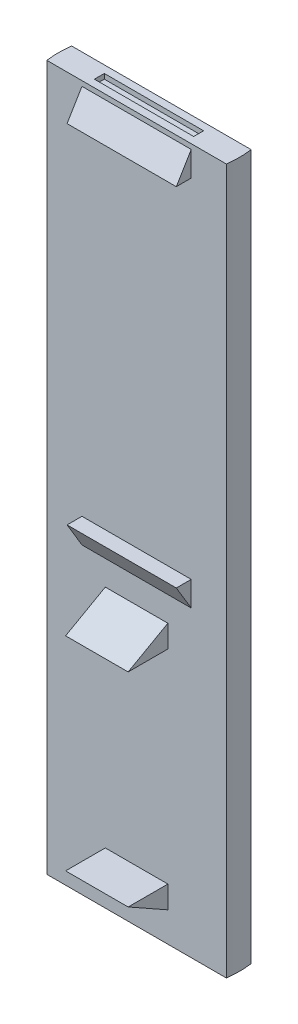
ISO-10303-21;
HEADER;
FILE_DESCRIPTION(('STEP AP214'),'2;1');
FILE_NAME('part.step','',(''),(''),'','','');
FILE_SCHEMA(('AUTOMOTIVE_DESIGN { 1 0 10303 214 1 1 1 1 }'));
ENDSEC;
DATA;
#1=APPLICATION_CONTEXT('core data for automotive mechanical design processes');
#2=APPLICATION_PROTOCOL_DEFINITION('international standard','automotive_design',2000,#1);
#3=PRODUCT_CONTEXT('',#1,'mechanical');
#4=PRODUCT('Part','Part','',(#3));
#5=PRODUCT_RELATED_PRODUCT_CATEGORY('part','',(#4));
#6=PRODUCT_DEFINITION_FORMATION('','',#4);
#7=PRODUCT_DEFINITION_CONTEXT('part definition',#1,'design');
#8=PRODUCT_DEFINITION('design','',#6,#7);
#9=PRODUCT_DEFINITION_SHAPE('','',#8);
#10=(LENGTH_UNIT() NAMED_UNIT(*) SI_UNIT(.MILLI.,.METRE.));
#11=(NAMED_UNIT(*) PLANE_ANGLE_UNIT() SI_UNIT($,.RADIAN.));
#12=(NAMED_UNIT(*) SI_UNIT($,.STERADIAN.) SOLID_ANGLE_UNIT());
#13=UNCERTAINTY_MEASURE_WITH_UNIT(LENGTH_MEASURE(1.E-05),#10,'distance_accuracy_value','');
#14=(GEOMETRIC_REPRESENTATION_CONTEXT(3) GLOBAL_UNCERTAINTY_ASSIGNED_CONTEXT((#13)) GLOBAL_UNIT_ASSIGNED_CONTEXT((#10,
#11,#12)) REPRESENTATION_CONTEXT('',''));
#15=CARTESIAN_POINT('',(0.,0.,0.));
#16=DIRECTION('',(0.,0.,1.));
#17=DIRECTION('',(1.,0.,0.));
#18=AXIS2_PLACEMENT_3D('',#15,#16,#17);
#19=CARTESIAN_POINT('',(49.53,-180.34,12.7));
#20=DIRECTION('',(0.,1.,0.));
#21=DIRECTION('',(0.,0.,1.));
#22=AXIS2_PLACEMENT_3D('',#19,#20,#21);
#23=PLANE('',#22);
#24=DIRECTION('',(0.,0.,1.));
#25=VECTOR('',#24,1.);
#26=CARTESIAN_POINT('',(-25.4,-180.34,8.89));
#27=LINE('',#26,#25);
#28=CARTESIAN_POINT('',(-25.4,-180.34,3.81));
#29=VERTEX_POINT('',#28);
#30=CARTESIAN_POINT('',(-25.4,-180.34,8.89));
#31=VERTEX_POINT('',#30);
#32=EDGE_CURVE('E242',#29,#31,#27,.T.);
#33=ORIENTED_EDGE('',*,*,#32,.T.);
#34=DIRECTION('',(1.,0.,0.));
#35=VECTOR('',#34,1.);
#36=CARTESIAN_POINT('',(25.4,-180.34,8.88999999999999));
#37=LINE('',#36,#35);
#38=CARTESIAN_POINT('',(25.4,-180.34,8.88999999999999));
#39=VERTEX_POINT('',#38);
#40=EDGE_CURVE('E467',#31,#39,#37,.T.);
#41=ORIENTED_EDGE('',*,*,#40,.T.);
#42=DIRECTION('',(0.,0.,-1.));
#43=VECTOR('',#42,1.);
#44=CARTESIAN_POINT('',(25.4,-180.34,8.88999999999999));
#45=LINE('',#44,#43);
#46=CARTESIAN_POINT('',(25.4,-180.34,3.80999999999999));
#47=VERTEX_POINT('',#46);
#48=EDGE_CURVE('E475',#39,#47,#45,.T.);
#49=ORIENTED_EDGE('',*,*,#48,.T.);
#50=DIRECTION('',(-1.,0.,0.));
#51=VECTOR('',#50,1.);
#52=CARTESIAN_POINT('',(25.4,-180.34,3.80999999999999));
#53=LINE('',#52,#51);
#54=EDGE_CURVE('E469',#47,#29,#53,.T.);
#55=ORIENTED_EDGE('',*,*,#54,.T.);
#56=EDGE_LOOP('',(#33,#41,#49,#55));
#57=FACE_BOUND('',#56,.T.);
#58=CARTESIAN_POINT('',(0.,-180.34,6.35));
#59=DIRECTION('',(0.,1.,0.));
#60=DIRECTION('',(0.,0.,1.));
#61=AXIS2_PLACEMENT_3D('',#58,#59,#60);
#62=CIRCLE('',#61,46.355);
#63=CARTESIAN_POINT('',(45.918008722069,-180.34,12.7));
#64=VERTEX_POINT('',#63);
#65=CARTESIAN_POINT('',(45.918008722069,-180.34,0.));
#66=VERTEX_POINT('',#65);
#67=EDGE_CURVE('E236',#64,#66,#62,.T.);
#68=ORIENTED_EDGE('',*,*,#67,.F.);
#69=DIRECTION('',(1.,0.,0.));
#70=VECTOR('',#69,1.);
#71=CARTESIAN_POINT('',(49.53,-180.34,12.7));
#72=LINE('',#71,#70);
#73=CARTESIAN_POINT('',(-45.9180087220689,-180.34,12.7));
#74=VERTEX_POINT('',#73);
#75=EDGE_CURVE('E248',#74,#64,#72,.T.);
#76=ORIENTED_EDGE('',*,*,#75,.F.);
#77=CARTESIAN_POINT('',(-45.9180087220689,-180.34,0.));
#78=VERTEX_POINT('',#77);
#79=EDGE_CURVE('E252',#78,#74,#62,.T.);
#80=ORIENTED_EDGE('',*,*,#79,.F.);
#81=DIRECTION('',(1.,0.,0.));
#82=VECTOR('',#81,1.);
#83=CARTESIAN_POINT('',(49.53,-180.34,0.));
#84=LINE('',#83,#82);
#85=EDGE_CURVE('E250',#78,#66,#84,.T.);
#86=ORIENTED_EDGE('',*,*,#85,.T.);
#87=EDGE_LOOP('',(#68,#76,#80,#86));
#88=FACE_BOUND('',#87,.T.);
#89=ADVANCED_FACE('F40',(#57,#88),#23,.F.);
#90=CARTESIAN_POINT('',(0.,0.,12.7));
#91=DIRECTION('',(0.,0.,1.));
#92=DIRECTION('',(1.,0.,0.));
#93=AXIS2_PLACEMENT_3D('',#90,#91,#92);
#94=PLANE('',#93);
#95=DIRECTION('',(0.,-1.,0.));
#96=VECTOR('',#95,1.);
#97=CARTESIAN_POINT('',(-27.94,0.,12.7));
#98=LINE('',#97,#96);
#99=CARTESIAN_POINT('',(-27.94,177.8,12.7));
#100=VERTEX_POINT('',#99);
#101=CARTESIAN_POINT('',(-27.94,165.1,12.7));
#102=VERTEX_POINT('',#101);
#103=EDGE_CURVE('E258',#100,#102,#98,.T.);
#104=ORIENTED_EDGE('',*,*,#103,.F.);
#105=DIRECTION('',(1.,0.,0.));
#106=VECTOR('',#105,1.);
#107=CARTESIAN_POINT('',(0.,177.8,12.7));
#108=LINE('',#107,#106);
#109=CARTESIAN_POINT('',(27.94,177.8,12.7));
#110=VERTEX_POINT('',#109);
#111=EDGE_CURVE('E269',#100,#110,#108,.T.);
#112=ORIENTED_EDGE('',*,*,#111,.T.);
#113=DIRECTION('',(0.,-1.,0.));
#114=VECTOR('',#113,1.);
#115=CARTESIAN_POINT('',(27.94,0.,12.7));
#116=LINE('',#115,#114);
#117=CARTESIAN_POINT('',(27.94,165.1,12.7));
#118=VERTEX_POINT('',#117);
#119=EDGE_CURVE('E272',#110,#118,#116,.T.);
#120=ORIENTED_EDGE('',*,*,#119,.T.);
#121=DIRECTION('',(1.,0.,0.));
#122=VECTOR('',#121,1.);
#123=CARTESIAN_POINT('',(0.,165.1,12.7));
#124=LINE('',#123,#122);
#125=EDGE_CURVE('E274',#102,#118,#124,.T.);
#126=ORIENTED_EDGE('',*,*,#125,.F.);
#127=EDGE_LOOP('',(#104,#112,#120,#126));
#128=FACE_BOUND('',#127,.T.);
#129=DIRECTION('',(1.,0.,0.));
#130=VECTOR('',#129,1.);
#131=CARTESIAN_POINT('',(0.,-165.1,12.7));
#132=LINE('',#131,#130);
#133=CARTESIAN_POINT('',(-16.002,-165.1,12.7));
#134=VERTEX_POINT('',#133);
#135=CARTESIAN_POINT('',(16.002,-165.1,12.7));
#136=VERTEX_POINT('',#135);
#137=EDGE_CURVE('E383',#134,#136,#132,.T.);
#138=ORIENTED_EDGE('',*,*,#137,.F.);
#139=DIRECTION('',(0.,1.,0.));
#140=VECTOR('',#139,1.);
#141=CARTESIAN_POINT('',(-16.002,0.,12.7));
#142=LINE('',#141,#140);
#143=CARTESIAN_POINT('',(-16.002,-153.67,12.7));
#144=VERTEX_POINT('',#143);
#145=EDGE_CURVE('E370',#134,#144,#142,.T.);
#146=ORIENTED_EDGE('',*,*,#145,.T.);
#147=DIRECTION('',(1.,0.,0.));
#148=VECTOR('',#147,1.);
#149=CARTESIAN_POINT('',(0.,-153.67,12.7));
#150=LINE('',#149,#148);
#151=CARTESIAN_POINT('',(16.002,-153.67,12.7));
#152=VERTEX_POINT('',#151);
#153=EDGE_CURVE('E381',#144,#152,#150,.T.);
#154=ORIENTED_EDGE('',*,*,#153,.T.);
#155=DIRECTION('',(0.,1.,0.));
#156=VECTOR('',#155,1.);
#157=CARTESIAN_POINT('',(16.002,0.,12.7));
#158=LINE('',#157,#156);
#159=EDGE_CURVE('E385',#136,#152,#158,.T.);
#160=ORIENTED_EDGE('',*,*,#159,.F.);
#161=EDGE_LOOP('',(#138,#146,#154,#160));
#162=FACE_BOUND('',#161,.T.);
#163=DIRECTION('',(0.,1.,0.));
#164=VECTOR('',#163,1.);
#165=CARTESIAN_POINT('',(-16.002,0.,12.7));
#166=LINE('',#165,#164);
#167=CARTESIAN_POINT('',(-16.002,-49.53,12.7));
#168=VERTEX_POINT('',#167);
#169=CARTESIAN_POINT('',(-16.002,-38.0999999999999,12.7));
#170=VERTEX_POINT('',#169);
#171=EDGE_CURVE('E398',#168,#170,#166,.T.);
#172=ORIENTED_EDGE('',*,*,#171,.T.);
#173=DIRECTION('',(1.,0.,0.));
#174=VECTOR('',#173,1.);
#175=CARTESIAN_POINT('',(0.,-38.0999999999999,12.7));
#176=LINE('',#175,#174);
#177=CARTESIAN_POINT('',(16.002,-38.0999999999999,12.7));
#178=VERTEX_POINT('',#177);
#179=EDGE_CURVE('E404',#170,#178,#176,.T.);
#180=ORIENTED_EDGE('',*,*,#179,.T.);
#181=DIRECTION('',(0.,1.,0.));
#182=VECTOR('',#181,1.);
#183=CARTESIAN_POINT('',(16.002,0.,12.7));
#184=LINE('',#183,#182);
#185=CARTESIAN_POINT('',(16.002,-49.53,12.7));
#186=VERTEX_POINT('',#185);
#187=EDGE_CURVE('E401',#186,#178,#184,.T.);
#188=ORIENTED_EDGE('',*,*,#187,.F.);
#189=DIRECTION('',(1.,0.,0.));
#190=VECTOR('',#189,1.);
#191=CARTESIAN_POINT('',(0.,-49.53,12.7));
#192=LINE('',#191,#190);
#193=EDGE_CURVE('E394',#168,#186,#192,.T.);
#194=ORIENTED_EDGE('',*,*,#193,.F.);
#195=EDGE_LOOP('',(#172,#180,#188,#194));
#196=FACE_BOUND('',#195,.T.);
#197=DIRECTION('',(1.,0.,0.));
#198=VECTOR('',#197,1.);
#199=CARTESIAN_POINT('',(0.,-25.4,12.7));
#200=LINE('',#199,#198);
#201=CARTESIAN_POINT('',(-27.94,-25.4,12.7));
#202=VERTEX_POINT('',#201);
#203=CARTESIAN_POINT('',(27.94,-25.4,12.7));
#204=VERTEX_POINT('',#203);
#205=EDGE_CURVE('E277',#202,#204,#200,.T.);
#206=ORIENTED_EDGE('',*,*,#205,.F.);
#207=DIRECTION('',(0.,-1.,0.));
#208=VECTOR('',#207,1.);
#209=CARTESIAN_POINT('',(-27.94,0.,12.7));
#210=LINE('',#209,#208);
#211=CARTESIAN_POINT('',(-27.94,-12.7,12.7));
#212=VERTEX_POINT('',#211);
#213=EDGE_CURVE('E279',#212,#202,#210,.T.);
#214=ORIENTED_EDGE('',*,*,#213,.F.);
#215=DIRECTION('',(1.,0.,0.));
#216=VECTOR('',#215,1.);
#217=CARTESIAN_POINT('',(0.,-12.7,12.7));
#218=LINE('',#217,#216);
#219=CARTESIAN_POINT('',(27.94,-12.7,12.7));
#220=VERTEX_POINT('',#219);
#221=EDGE_CURVE('E282',#212,#220,#218,.T.);
#222=ORIENTED_EDGE('',*,*,#221,.T.);
#223=DIRECTION('',(0.,-1.,0.));
#224=VECTOR('',#223,1.);
#225=CARTESIAN_POINT('',(27.94,0.,12.7));
#226=LINE('',#225,#224);
#227=EDGE_CURVE('E47',#220,#204,#226,.T.);
#228=ORIENTED_EDGE('',*,*,#227,.T.);
#229=EDGE_LOOP('',(#206,#214,#222,#228));
#230=FACE_BOUND('',#229,.T.);
#231=ORIENTED_EDGE('',*,*,#75,.T.);
#232=DIRECTION('',(0.,1.,0.));
#233=VECTOR('',#232,1.);
#234=CARTESIAN_POINT('',(45.918008722069,-180.34,12.7));
#235=LINE('',#234,#233);
#236=CARTESIAN_POINT('',(45.918008722069,180.34,12.7));
#237=VERTEX_POINT('',#236);
#238=EDGE_CURVE('E233',#64,#237,#235,.T.);
#239=ORIENTED_EDGE('',*,*,#238,.T.);
#240=DIRECTION('',(-1.,0.,0.));
#241=VECTOR('',#240,1.);
#242=CARTESIAN_POINT('',(49.53,180.34,12.7));
#243=LINE('',#242,#241);
#244=CARTESIAN_POINT('',(-45.9180087220689,180.34,12.7));
#245=VERTEX_POINT('',#244);
#246=EDGE_CURVE('E255',#237,#245,#243,.T.);
#247=ORIENTED_EDGE('',*,*,#246,.T.);
#248=DIRECTION('',(0.,1.,0.));
#249=VECTOR('',#248,1.);
#250=CARTESIAN_POINT('',(-45.9180087220689,-180.34,12.7));
#251=LINE('',#250,#249);
#252=EDGE_CURVE('E53',#245,#74,#251,.F.);
#253=ORIENTED_EDGE('',*,*,#252,.T.);
#254=EDGE_LOOP('',(#231,#239,#247,#253));
#255=FACE_BOUND('',#254,.T.);
#256=ADVANCED_FACE('F254',(#128,#162,#196,#230,#255),#94,.T.);
#257=CARTESIAN_POINT('',(0.,0.,0.));
#258=DIRECTION('',(0.,0.,1.));
#259=DIRECTION('',(1.,0.,0.));
#260=AXIS2_PLACEMENT_3D('',#257,#258,#259);
#261=PLANE('',#260);
#262=DIRECTION('',(0.,1.,0.));
#263=VECTOR('',#262,1.);
#264=CARTESIAN_POINT('',(16.002,0.,0.));
#265=LINE('',#264,#263);
#266=CARTESIAN_POINT('',(16.002,-49.53,0.));
#267=VERTEX_POINT('',#266);
#268=CARTESIAN_POINT('',(16.002,-38.0999999999999,0.));
#269=VERTEX_POINT('',#268);
#270=EDGE_CURVE('E338',#267,#269,#265,.T.);
#271=ORIENTED_EDGE('',*,*,#270,.T.);
#272=DIRECTION('',(1.,0.,0.));
#273=VECTOR('',#272,1.);
#274=CARTESIAN_POINT('',(0.,-38.0999999999999,0.));
#275=LINE('',#274,#273);
#276=CARTESIAN_POINT('',(-16.002,-38.0999999999999,0.));
#277=VERTEX_POINT('',#276);
#278=EDGE_CURVE('E344',#277,#269,#275,.T.);
#279=ORIENTED_EDGE('',*,*,#278,.F.);
#280=DIRECTION('',(0.,1.,0.));
#281=VECTOR('',#280,1.);
#282=CARTESIAN_POINT('',(-16.002,0.,0.));
#283=LINE('',#282,#281);
#284=CARTESIAN_POINT('',(-16.002,-49.53,0.));
#285=VERTEX_POINT('',#284);
#286=EDGE_CURVE('E341',#285,#277,#283,.T.);
#287=ORIENTED_EDGE('',*,*,#286,.F.);
#288=DIRECTION('',(1.,0.,0.));
#289=VECTOR('',#288,1.);
#290=CARTESIAN_POINT('',(0.,-49.53,0.));
#291=LINE('',#290,#289);
#292=EDGE_CURVE('E333',#285,#267,#291,.T.);
#293=ORIENTED_EDGE('',*,*,#292,.T.);
#294=EDGE_LOOP('',(#271,#279,#287,#293));
#295=FACE_BOUND('',#294,.T.);
#296=DIRECTION('',(1.,0.,0.));
#297=VECTOR('',#296,1.);
#298=CARTESIAN_POINT('',(0.,-165.1,0.));
#299=LINE('',#298,#297);
#300=CARTESIAN_POINT('',(-16.002,-165.1,0.));
#301=VERTEX_POINT('',#300);
#302=CARTESIAN_POINT('',(16.002,-165.1,0.));
#303=VERTEX_POINT('',#302);
#304=EDGE_CURVE('E319',#301,#303,#299,.T.);
#305=ORIENTED_EDGE('',*,*,#304,.T.);
#306=DIRECTION('',(0.,1.,0.));
#307=VECTOR('',#306,1.);
#308=CARTESIAN_POINT('',(16.002,0.,0.));
#309=LINE('',#308,#307);
#310=CARTESIAN_POINT('',(16.002,-153.67,0.));
#311=VERTEX_POINT('',#310);
#312=EDGE_CURVE('E325',#303,#311,#309,.T.);
#313=ORIENTED_EDGE('',*,*,#312,.T.);
#314=DIRECTION('',(1.,0.,0.));
#315=VECTOR('',#314,1.);
#316=CARTESIAN_POINT('',(0.,-153.67,0.));
#317=LINE('',#316,#315);
#318=CARTESIAN_POINT('',(-16.002,-153.67,0.));
#319=VERTEX_POINT('',#318);
#320=EDGE_CURVE('E322',#319,#311,#317,.T.);
#321=ORIENTED_EDGE('',*,*,#320,.F.);
#322=DIRECTION('',(0.,1.,0.));
#323=VECTOR('',#322,1.);
#324=CARTESIAN_POINT('',(-16.002,0.,0.));
#325=LINE('',#324,#323);
#326=EDGE_CURVE('E315',#301,#319,#325,.T.);
#327=ORIENTED_EDGE('',*,*,#326,.F.);
#328=EDGE_LOOP('',(#305,#313,#321,#327));
#329=FACE_BOUND('',#328,.T.);
#330=DIRECTION('',(0.,1.,0.));
#331=VECTOR('',#330,1.);
#332=CARTESIAN_POINT('',(45.918008722069,-180.34,0.));
#333=LINE('',#332,#331);
#334=CARTESIAN_POINT('',(45.918008722069,180.34,0.));
#335=VERTEX_POINT('',#334);
#336=EDGE_CURVE('E61',#66,#335,#333,.T.);
#337=ORIENTED_EDGE('',*,*,#336,.F.);
#338=ORIENTED_EDGE('',*,*,#85,.F.);
#339=DIRECTION('',(0.,1.,0.));
#340=VECTOR('',#339,1.);
#341=CARTESIAN_POINT('',(-45.9180087220689,-180.34,0.));
#342=LINE('',#341,#340);
#343=CARTESIAN_POINT('',(-45.9180087220689,180.34,0.));
#344=VERTEX_POINT('',#343);
#345=EDGE_CURVE('E251',#344,#78,#342,.F.);
#346=ORIENTED_EDGE('',*,*,#345,.F.);
#347=DIRECTION('',(-1.,0.,0.));
#348=VECTOR('',#347,1.);
#349=CARTESIAN_POINT('',(49.53,180.34,0.));
#350=LINE('',#349,#348);
#351=EDGE_CURVE('E256',#335,#344,#350,.T.);
#352=ORIENTED_EDGE('',*,*,#351,.F.);
#353=EDGE_LOOP('',(#337,#338,#346,#352));
#354=FACE_BOUND('',#353,.T.);
#355=ADVANCED_FACE('F360',(#295,#329,#354),#261,.F.);
#356=CARTESIAN_POINT('',(49.53,180.34,12.7));
#357=DIRECTION('',(0.,-1.,0.));
#358=DIRECTION('',(0.,0.,-1.));
#359=AXIS2_PLACEMENT_3D('',#356,#357,#358);
#360=PLANE('',#359);
#361=DIRECTION('',(1.,0.,0.));
#362=VECTOR('',#361,1.);
#363=CARTESIAN_POINT('',(25.4,180.34,8.88999999999999));
#364=LINE('',#363,#362);
#365=CARTESIAN_POINT('',(-25.4,180.34,8.89));
#366=VERTEX_POINT('',#365);
#367=CARTESIAN_POINT('',(25.4,180.34,8.88999999999999));
#368=VERTEX_POINT('',#367);
#369=EDGE_CURVE('E508',#366,#368,#364,.T.);
#370=ORIENTED_EDGE('',*,*,#369,.F.);
#371=DIRECTION('',(0.,0.,1.));
#372=VECTOR('',#371,1.);
#373=CARTESIAN_POINT('',(-25.4,180.34,8.89));
#374=LINE('',#373,#372);
#375=CARTESIAN_POINT('',(-25.4,180.34,3.81));
#376=VERTEX_POINT('',#375);
#377=EDGE_CURVE('E486',#376,#366,#374,.T.);
#378=ORIENTED_EDGE('',*,*,#377,.F.);
#379=DIRECTION('',(-1.,0.,0.));
#380=VECTOR('',#379,1.);
#381=CARTESIAN_POINT('',(25.4,180.34,3.80999999999999));
#382=LINE('',#381,#380);
#383=CARTESIAN_POINT('',(25.4,180.34,3.80999999999999));
#384=VERTEX_POINT('',#383);
#385=EDGE_CURVE('E497',#384,#376,#382,.T.);
#386=ORIENTED_EDGE('',*,*,#385,.F.);
#387=DIRECTION('',(0.,0.,-1.));
#388=VECTOR('',#387,1.);
#389=CARTESIAN_POINT('',(25.4,180.34,8.88999999999999));
#390=LINE('',#389,#388);
#391=EDGE_CURVE('E511',#368,#384,#390,.T.);
#392=ORIENTED_EDGE('',*,*,#391,.F.);
#393=EDGE_LOOP('',(#370,#378,#386,#392));
#394=FACE_BOUND('',#393,.T.);
#395=CARTESIAN_POINT('',(0.,180.34,6.35));
#396=DIRECTION('',(0.,1.,0.));
#397=DIRECTION('',(0.,0.,1.));
#398=AXIS2_PLACEMENT_3D('',#395,#396,#397);
#399=CIRCLE('',#398,46.355);
#400=EDGE_CURVE('E237',#237,#335,#399,.T.);
#401=ORIENTED_EDGE('',*,*,#400,.T.);
#402=ORIENTED_EDGE('',*,*,#351,.T.);
#403=CARTESIAN_POINT('',(0.,180.34,6.35));
#404=DIRECTION('',(0.,-1.,0.));
#405=DIRECTION('',(0.,0.,-1.));
#406=AXIS2_PLACEMENT_3D('',#403,#404,#405);
#407=CIRCLE('',#406,46.355);
#408=EDGE_CURVE('E11',#245,#344,#407,.T.);
#409=ORIENTED_EDGE('',*,*,#408,.F.);
#410=ORIENTED_EDGE('',*,*,#246,.F.);
#411=EDGE_LOOP('',(#401,#402,#409,#410));
#412=FACE_BOUND('',#411,.T.);
#413=ADVANCED_FACE('F666',(#394,#412),#360,.F.);
#414=CARTESIAN_POINT('',(0.,-49.53,-20.32));
#415=DIRECTION('',(0.,-1.,0.));
#416=DIRECTION('',(0.,0.,-1.));
#417=AXIS2_PLACEMENT_3D('',#414,#415,#416);
#418=PLANE('',#417);
#419=ORIENTED_EDGE('',*,*,#292,.F.);
#420=DIRECTION('',(0.,0.,1.));
#421=VECTOR('',#420,1.);
#422=CARTESIAN_POINT('',(-16.002,-49.53,-20.32));
#423=LINE('',#422,#421);
#424=CARTESIAN_POINT('',(-16.002,-49.53,-20.32));
#425=VERTEX_POINT('',#424);
#426=EDGE_CURVE('E263',#425,#285,#423,.T.);
#427=ORIENTED_EDGE('',*,*,#426,.F.);
#428=DIRECTION('',(1.,0.,0.));
#429=VECTOR('',#428,1.);
#430=CARTESIAN_POINT('',(0.,-49.53,-20.32));
#431=LINE('',#430,#429);
#432=CARTESIAN_POINT('',(16.002,-49.53,-20.32));
#433=VERTEX_POINT('',#432);
#434=EDGE_CURVE('E334',#425,#433,#431,.T.);
#435=ORIENTED_EDGE('',*,*,#434,.T.);
#436=DIRECTION('',(0.,0.,1.));
#437=VECTOR('',#436,1.);
#438=CARTESIAN_POINT('',(16.002,-49.53,-20.32));
#439=LINE('',#438,#437);
#440=EDGE_CURVE('E337',#433,#267,#439,.T.);
#441=ORIENTED_EDGE('',*,*,#440,.T.);
#442=EDGE_LOOP('',(#419,#427,#435,#441));
#443=FACE_BOUND('',#442,.T.);
#444=ADVANCED_FACE('F358',(#443),#418,.T.);
#445=CARTESIAN_POINT('',(-16.002,0.,-20.32));
#446=DIRECTION('',(1.,0.,0.));
#447=DIRECTION('',(0.,0.,-1.));
#448=AXIS2_PLACEMENT_3D('',#445,#446,#447);
#449=PLANE('',#448);
#450=ORIENTED_EDGE('',*,*,#286,.T.);
#451=DIRECTION('',(0.,-0.490261239632559,-0.871575537124549));
#452=VECTOR('',#451,1.);
#453=CARTESIAN_POINT('',(-16.002,-37.6251632047477,0.844154302670604));
#454=LINE('',#453,#452);
#455=EDGE_CURVE('E357',#277,#425,#454,.T.);
#456=ORIENTED_EDGE('',*,*,#455,.T.);
#457=ORIENTED_EDGE('',*,*,#426,.T.);
#458=EDGE_LOOP('',(#450,#456,#457));
#459=FACE_BOUND('',#458,.T.);
#460=ADVANCED_FACE('F354',(#459),#449,.F.);
#461=CARTESIAN_POINT('',(16.002,0.,-20.32));
#462=DIRECTION('',(1.,0.,0.));
#463=DIRECTION('',(0.,0.,-1.));
#464=AXIS2_PLACEMENT_3D('',#461,#462,#463);
#465=PLANE('',#464);
#466=DIRECTION('',(0.,-0.490261239632559,-0.871575537124549));
#467=VECTOR('',#466,1.);
#468=CARTESIAN_POINT('',(16.002,-37.6251632047477,0.844154302670604));
#469=LINE('',#468,#467);
#470=EDGE_CURVE('E365',#269,#433,#469,.T.);
#471=ORIENTED_EDGE('',*,*,#470,.F.);
#472=ORIENTED_EDGE('',*,*,#270,.F.);
#473=ORIENTED_EDGE('',*,*,#440,.F.);
#474=EDGE_LOOP('',(#471,#472,#473));
#475=FACE_BOUND('',#474,.T.);
#476=ADVANCED_FACE('F367',(#475),#465,.T.);
#477=CARTESIAN_POINT('',(-16.002,0.,-20.32));
#478=DIRECTION('',(1.,0.,0.));
#479=DIRECTION('',(0.,0.,-1.));
#480=AXIS2_PLACEMENT_3D('',#477,#478,#479);
#481=PLANE('',#480);
#482=DIRECTION('',(0.,0.,1.));
#483=VECTOR('',#482,1.);
#484=CARTESIAN_POINT('',(-16.002,-153.67,-20.32));
#485=LINE('',#484,#483);
#486=CARTESIAN_POINT('',(-16.002,-153.67,-20.32));
#487=VERTEX_POINT('',#486);
#488=EDGE_CURVE('E331',#487,#319,#485,.T.);
#489=ORIENTED_EDGE('',*,*,#488,.F.);
#490=DIRECTION('',(0.,-0.490261239632561,0.871575537124548));
#491=VECTOR('',#490,1.);
#492=CARTESIAN_POINT('',(-16.002,-116.734480712166,-85.9831454005936));
#493=LINE('',#492,#491);
#494=EDGE_CURVE('E368',#487,#301,#493,.T.);
#495=ORIENTED_EDGE('',*,*,#494,.T.);
#496=ORIENTED_EDGE('',*,*,#326,.T.);
#497=EDGE_LOOP('',(#489,#495,#496));
#498=FACE_BOUND('',#497,.T.);
#499=ADVANCED_FACE('F444',(#498),#481,.F.);
#500=CARTESIAN_POINT('',(0.,-153.67,-20.32));
#501=DIRECTION('',(0.,-1.,0.));
#502=DIRECTION('',(0.,0.,-1.));
#503=AXIS2_PLACEMENT_3D('',#500,#501,#502);
#504=PLANE('',#503);
#505=ORIENTED_EDGE('',*,*,#320,.T.);
#506=DIRECTION('',(0.,0.,1.));
#507=VECTOR('',#506,1.);
#508=CARTESIAN_POINT('',(16.002,-153.67,-20.32));
#509=LINE('',#508,#507);
#510=CARTESIAN_POINT('',(16.002,-153.67,-20.32));
#511=VERTEX_POINT('',#510);
#512=EDGE_CURVE('E318',#511,#311,#509,.T.);
#513=ORIENTED_EDGE('',*,*,#512,.F.);
#514=DIRECTION('',(1.,0.,0.));
#515=VECTOR('',#514,1.);
#516=CARTESIAN_POINT('',(0.,-153.67,-20.32));
#517=LINE('',#516,#515);
#518=EDGE_CURVE('E316',#487,#511,#517,.T.);
#519=ORIENTED_EDGE('',*,*,#518,.F.);
#520=ORIENTED_EDGE('',*,*,#488,.T.);
#521=EDGE_LOOP('',(#505,#513,#519,#520));
#522=FACE_BOUND('',#521,.T.);
#523=ADVANCED_FACE('F446',(#522),#504,.F.);
#524=CARTESIAN_POINT('',(16.002,0.,-20.32));
#525=DIRECTION('',(1.,0.,0.));
#526=DIRECTION('',(0.,0.,-1.));
#527=AXIS2_PLACEMENT_3D('',#524,#525,#526);
#528=PLANE('',#527);
#529=DIRECTION('',(0.,-0.490261239632561,0.871575537124548));
#530=VECTOR('',#529,1.);
#531=CARTESIAN_POINT('',(16.002,-116.734480712166,-85.9831454005936));
#532=LINE('',#531,#530);
#533=EDGE_CURVE('E373',#511,#303,#532,.T.);
#534=ORIENTED_EDGE('',*,*,#533,.F.);
#535=ORIENTED_EDGE('',*,*,#512,.T.);
#536=ORIENTED_EDGE('',*,*,#312,.F.);
#537=EDGE_LOOP('',(#534,#535,#536));
#538=FACE_BOUND('',#537,.T.);
#539=ADVANCED_FACE('F438',(#538),#528,.T.);
#540=CARTESIAN_POINT('',(0.,165.1,20.32));
#541=DIRECTION('',(0.,-1.,0.));
#542=DIRECTION('',(0.,0.,-1.));
#543=AXIS2_PLACEMENT_3D('',#540,#541,#542);
#544=PLANE('',#543);
#545=DIRECTION('',(0.,0.,-1.));
#546=VECTOR('',#545,1.);
#547=CARTESIAN_POINT('',(-27.94,165.1,20.32));
#548=LINE('',#547,#546);
#549=CARTESIAN_POINT('',(-27.94,165.1,20.32));
#550=VERTEX_POINT('',#549);
#551=EDGE_CURVE('E305',#550,#102,#548,.T.);
#552=ORIENTED_EDGE('',*,*,#551,.T.);
#553=ORIENTED_EDGE('',*,*,#125,.T.);
#554=DIRECTION('',(0.,0.,-1.));
#555=VECTOR('',#554,1.);
#556=CARTESIAN_POINT('',(27.94,165.1,20.32));
#557=LINE('',#556,#555);
#558=CARTESIAN_POINT('',(27.94,165.1,20.32));
#559=VERTEX_POINT('',#558);
#560=EDGE_CURVE('E312',#559,#118,#557,.T.);
#561=ORIENTED_EDGE('',*,*,#560,.F.);
#562=DIRECTION('',(-1.,0.,0.));
#563=VECTOR('',#562,1.);
#564=CARTESIAN_POINT('',(0.,165.1,20.32));
#565=LINE('',#564,#563);
#566=EDGE_CURVE('E301',#559,#550,#565,.T.);
#567=ORIENTED_EDGE('',*,*,#566,.T.);
#568=EDGE_LOOP('',(#552,#553,#561,#567));
#569=FACE_BOUND('',#568,.T.);
#570=ADVANCED_FACE('F453',(#569),#544,.T.);
#571=CARTESIAN_POINT('',(27.94,0.,20.32));
#572=DIRECTION('',(-1.,0.,0.));
#573=DIRECTION('',(0.,0.,1.));
#574=AXIS2_PLACEMENT_3D('',#571,#572,#573);
#575=PLANE('',#574);
#576=ORIENTED_EDGE('',*,*,#119,.F.);
#577=DIRECTION('',(0.,-0.857492925712544,0.514495755427527));
#578=VECTOR('',#577,1.);
#579=CARTESIAN_POINT('',(27.94,43.7029411764706,93.1582352941177));
#580=LINE('',#579,#578);
#581=EDGE_CURVE('E429',#110,#559,#580,.T.);
#582=ORIENTED_EDGE('',*,*,#581,.T.);
#583=ORIENTED_EDGE('',*,*,#560,.T.);
#584=EDGE_LOOP('',(#576,#582,#583));
#585=FACE_BOUND('',#584,.T.);
#586=ADVANCED_FACE('F562',(#585),#575,.F.);
#587=CARTESIAN_POINT('',(-27.94,0.,20.32));
#588=DIRECTION('',(-1.,0.,0.));
#589=DIRECTION('',(0.,0.,1.));
#590=AXIS2_PLACEMENT_3D('',#587,#588,#589);
#591=PLANE('',#590);
#592=DIRECTION('',(0.,-0.857492925712544,0.514495755427527));
#593=VECTOR('',#592,1.);
#594=CARTESIAN_POINT('',(-27.94,43.7029411764706,93.1582352941177));
#595=LINE('',#594,#593);
#596=EDGE_CURVE('E421',#100,#550,#595,.T.);
#597=ORIENTED_EDGE('',*,*,#596,.F.);
#598=ORIENTED_EDGE('',*,*,#103,.T.);
#599=ORIENTED_EDGE('',*,*,#551,.F.);
#600=EDGE_LOOP('',(#597,#598,#599));
#601=FACE_BOUND('',#600,.T.);
#602=ADVANCED_FACE('F559',(#601),#591,.T.);
#603=CARTESIAN_POINT('',(27.94,0.,20.32));
#604=DIRECTION('',(-1.,0.,0.));
#605=DIRECTION('',(0.,0.,1.));
#606=AXIS2_PLACEMENT_3D('',#603,#604,#605);
#607=PLANE('',#606);
#608=DIRECTION('',(0.,0.,-1.));
#609=VECTOR('',#608,1.);
#610=CARTESIAN_POINT('',(27.94,-12.7,20.32));
#611=LINE('',#610,#609);
#612=CARTESIAN_POINT('',(27.94,-12.7,20.32));
#613=VERTEX_POINT('',#612);
#614=EDGE_CURVE('E293',#613,#220,#611,.T.);
#615=ORIENTED_EDGE('',*,*,#614,.F.);
#616=DIRECTION('',(0.,-0.857492925712544,-0.514495755427527));
#617=VECTOR('',#616,1.);
#618=CARTESIAN_POINT('',(27.94,-3.36176470588236,25.9229411764706));
#619=LINE('',#618,#617);
#620=EDGE_CURVE('E294',#613,#204,#619,.T.);
#621=ORIENTED_EDGE('',*,*,#620,.T.);
#622=ORIENTED_EDGE('',*,*,#227,.F.);
#623=EDGE_LOOP('',(#615,#621,#622));
#624=FACE_BOUND('',#623,.T.);
#625=ADVANCED_FACE('F292',(#624),#607,.F.);
#626=CARTESIAN_POINT('',(0.,-12.7,20.32));
#627=DIRECTION('',(0.,-1.,0.));
#628=DIRECTION('',(0.,0.,-1.));
#629=AXIS2_PLACEMENT_3D('',#626,#627,#628);
#630=PLANE('',#629);
#631=ORIENTED_EDGE('',*,*,#221,.F.);
#632=DIRECTION('',(0.,0.,-1.));
#633=VECTOR('',#632,1.);
#634=CARTESIAN_POINT('',(-27.94,-12.7,20.32));
#635=LINE('',#634,#633);
#636=CARTESIAN_POINT('',(-27.94,-12.7,20.32));
#637=VERTEX_POINT('',#636);
#638=EDGE_CURVE('E302',#637,#212,#635,.T.);
#639=ORIENTED_EDGE('',*,*,#638,.F.);
#640=DIRECTION('',(-1.,0.,0.));
#641=VECTOR('',#640,1.);
#642=CARTESIAN_POINT('',(0.,-12.7,20.32));
#643=LINE('',#642,#641);
#644=EDGE_CURVE('E300',#613,#637,#643,.T.);
#645=ORIENTED_EDGE('',*,*,#644,.F.);
#646=ORIENTED_EDGE('',*,*,#614,.T.);
#647=EDGE_LOOP('',(#631,#639,#645,#646));
#648=FACE_BOUND('',#647,.T.);
#649=ADVANCED_FACE('F297',(#648),#630,.F.);
#650=CARTESIAN_POINT('',(-27.94,0.,20.32));
#651=DIRECTION('',(-1.,0.,0.));
#652=DIRECTION('',(0.,0.,1.));
#653=AXIS2_PLACEMENT_3D('',#650,#651,#652);
#654=PLANE('',#653);
#655=DIRECTION('',(0.,-0.857492925712544,-0.514495755427527));
#656=VECTOR('',#655,1.);
#657=CARTESIAN_POINT('',(-27.94,-3.36176470588236,25.9229411764706));
#658=LINE('',#657,#656);
#659=EDGE_CURVE('E416',#637,#202,#658,.T.);
#660=ORIENTED_EDGE('',*,*,#659,.F.);
#661=ORIENTED_EDGE('',*,*,#638,.T.);
#662=ORIENTED_EDGE('',*,*,#213,.T.);
#663=EDGE_LOOP('',(#660,#661,#662));
#664=FACE_BOUND('',#663,.T.);
#665=ADVANCED_FACE('F418',(#664),#654,.T.);
#666=CARTESIAN_POINT('',(0.,-49.53,33.02));
#667=DIRECTION('',(0.,1.,0.));
#668=DIRECTION('',(0.,0.,1.));
#669=AXIS2_PLACEMENT_3D('',#666,#667,#668);
#670=PLANE('',#669);
#671=ORIENTED_EDGE('',*,*,#193,.T.);
#672=DIRECTION('',(0.,0.,-1.));
#673=VECTOR('',#672,1.);
#674=CARTESIAN_POINT('',(16.002,-49.53,33.02));
#675=LINE('',#674,#673);
#676=CARTESIAN_POINT('',(16.002,-49.53,33.02));
#677=VERTEX_POINT('',#676);
#678=EDGE_CURVE('E411',#677,#186,#675,.T.);
#679=ORIENTED_EDGE('',*,*,#678,.F.);
#680=DIRECTION('',(1.,0.,0.));
#681=VECTOR('',#680,1.);
#682=CARTESIAN_POINT('',(0.,-49.53,33.02));
#683=LINE('',#682,#681);
#684=CARTESIAN_POINT('',(-16.002,-49.53,33.02));
#685=VERTEX_POINT('',#684);
#686=EDGE_CURVE('E395',#685,#677,#683,.T.);
#687=ORIENTED_EDGE('',*,*,#686,.F.);
#688=DIRECTION('',(0.,0.,-1.));
#689=VECTOR('',#688,1.);
#690=CARTESIAN_POINT('',(-16.002,-49.53,33.02));
#691=LINE('',#690,#689);
#692=EDGE_CURVE('E397',#685,#168,#691,.T.);
#693=ORIENTED_EDGE('',*,*,#692,.T.);
#694=EDGE_LOOP('',(#671,#679,#687,#693));
#695=FACE_BOUND('',#694,.T.);
#696=ADVANCED_FACE('F538',(#695),#670,.F.);
#697=CARTESIAN_POINT('',(16.002,0.,33.02));
#698=DIRECTION('',(-1.,0.,0.));
#699=DIRECTION('',(0.,0.,1.));
#700=AXIS2_PLACEMENT_3D('',#697,#698,#699);
#701=PLANE('',#700);
#702=ORIENTED_EDGE('',*,*,#187,.T.);
#703=DIRECTION('',(0.,-0.490261239632559,0.871575537124549));
#704=VECTOR('',#703,1.);
#705=CARTESIAN_POINT('',(16.002,-37.6251632047477,11.8558456973294));
#706=LINE('',#705,#704);
#707=EDGE_CURVE('E419',#178,#677,#706,.T.);
#708=ORIENTED_EDGE('',*,*,#707,.T.);
#709=ORIENTED_EDGE('',*,*,#678,.T.);
#710=EDGE_LOOP('',(#702,#708,#709));
#711=FACE_BOUND('',#710,.T.);
#712=ADVANCED_FACE('F540',(#711),#701,.F.);
#713=CARTESIAN_POINT('',(-16.002,0.,33.02));
#714=DIRECTION('',(-1.,0.,0.));
#715=DIRECTION('',(0.,0.,1.));
#716=AXIS2_PLACEMENT_3D('',#713,#714,#715);
#717=PLANE('',#716);
#718=DIRECTION('',(0.,-0.490261239632559,0.871575537124549));
#719=VECTOR('',#718,1.);
#720=CARTESIAN_POINT('',(-16.002,-37.6251632047477,11.8558456973294));
#721=LINE('',#720,#719);
#722=EDGE_CURVE('E424',#170,#685,#721,.T.);
#723=ORIENTED_EDGE('',*,*,#722,.F.);
#724=ORIENTED_EDGE('',*,*,#171,.F.);
#725=ORIENTED_EDGE('',*,*,#692,.F.);
#726=EDGE_LOOP('',(#723,#724,#725));
#727=FACE_BOUND('',#726,.T.);
#728=ADVANCED_FACE('F535',(#727),#717,.T.);
#729=CARTESIAN_POINT('',(-16.002,0.,33.02));
#730=DIRECTION('',(-1.,0.,0.));
#731=DIRECTION('',(0.,0.,1.));
#732=AXIS2_PLACEMENT_3D('',#729,#730,#731);
#733=PLANE('',#732);
#734=DIRECTION('',(0.,-0.490261239632561,-0.871575537124548));
#735=VECTOR('',#734,1.);
#736=CARTESIAN_POINT('',(-16.002,-116.734480712166,98.6831454005936));
#737=LINE('',#736,#735);
#738=CARTESIAN_POINT('',(-16.002,-153.67,33.02));
#739=VERTEX_POINT('',#738);
#740=EDGE_CURVE('E527',#739,#134,#737,.T.);
#741=ORIENTED_EDGE('',*,*,#740,.F.);
#742=DIRECTION('',(0.,0.,-1.));
#743=VECTOR('',#742,1.);
#744=CARTESIAN_POINT('',(-16.002,-153.67,33.02));
#745=LINE('',#744,#743);
#746=EDGE_CURVE('E380',#739,#144,#745,.T.);
#747=ORIENTED_EDGE('',*,*,#746,.T.);
#748=ORIENTED_EDGE('',*,*,#145,.F.);
#749=EDGE_LOOP('',(#741,#747,#748));
#750=FACE_BOUND('',#749,.T.);
#751=ADVANCED_FACE('F548',(#750),#733,.T.);
#752=CARTESIAN_POINT('',(16.002,0.,33.02));
#753=DIRECTION('',(-1.,0.,0.));
#754=DIRECTION('',(0.,0.,1.));
#755=AXIS2_PLACEMENT_3D('',#752,#753,#754);
#756=PLANE('',#755);
#757=DIRECTION('',(0.,0.,-1.));
#758=VECTOR('',#757,1.);
#759=CARTESIAN_POINT('',(16.002,-153.67,33.02));
#760=LINE('',#759,#758);
#761=CARTESIAN_POINT('',(16.002,-153.67,33.02));
#762=VERTEX_POINT('',#761);
#763=EDGE_CURVE('E391',#762,#152,#760,.T.);
#764=ORIENTED_EDGE('',*,*,#763,.F.);
#765=DIRECTION('',(0.,-0.490261239632561,-0.871575537124548));
#766=VECTOR('',#765,1.);
#767=CARTESIAN_POINT('',(16.002,-116.734480712166,98.6831454005936));
#768=LINE('',#767,#766);
#769=EDGE_CURVE('E518',#762,#136,#768,.T.);
#770=ORIENTED_EDGE('',*,*,#769,.T.);
#771=ORIENTED_EDGE('',*,*,#159,.T.);
#772=EDGE_LOOP('',(#764,#770,#771));
#773=FACE_BOUND('',#772,.T.);
#774=ADVANCED_FACE('F594',(#773),#756,.F.);
#775=CARTESIAN_POINT('',(0.,-153.67,33.02));
#776=DIRECTION('',(0.,1.,0.));
#777=DIRECTION('',(0.,0.,1.));
#778=AXIS2_PLACEMENT_3D('',#775,#776,#777);
#779=PLANE('',#778);
#780=ORIENTED_EDGE('',*,*,#153,.F.);
#781=ORIENTED_EDGE('',*,*,#746,.F.);
#782=DIRECTION('',(1.,0.,0.));
#783=VECTOR('',#782,1.);
#784=CARTESIAN_POINT('',(0.,-153.67,33.02));
#785=LINE('',#784,#783);
#786=EDGE_CURVE('E377',#739,#762,#785,.T.);
#787=ORIENTED_EDGE('',*,*,#786,.T.);
#788=ORIENTED_EDGE('',*,*,#763,.T.);
#789=EDGE_LOOP('',(#780,#781,#787,#788));
#790=FACE_BOUND('',#789,.T.);
#791=ADVANCED_FACE('F590',(#790),#779,.T.);
#792=CARTESIAN_POINT('',(-38.1,-153.67,33.02));
#793=DIRECTION('',(0.,0.871575537124548,-0.490261239632561));
#794=DIRECTION('',(0.,0.490261239632561,0.871575537124548));
#795=AXIS2_PLACEMENT_3D('',#792,#793,#794);
#796=PLANE('',#795);
#797=ORIENTED_EDGE('',*,*,#740,.T.);
#798=ORIENTED_EDGE('',*,*,#137,.T.);
#799=ORIENTED_EDGE('',*,*,#769,.F.);
#800=ORIENTED_EDGE('',*,*,#786,.F.);
#801=EDGE_LOOP('',(#797,#798,#799,#800));
#802=FACE_BOUND('',#801,.T.);
#803=ADVANCED_FACE('F593',(#802),#796,.F.);
#804=CARTESIAN_POINT('',(-38.1,-38.0999999999999,12.7));
#805=DIRECTION('',(0.,-0.871575537124549,-0.490261239632559));
#806=DIRECTION('',(0.,0.490261239632559,-0.871575537124549));
#807=AXIS2_PLACEMENT_3D('',#804,#805,#806);
#808=PLANE('',#807);
#809=ORIENTED_EDGE('',*,*,#179,.F.);
#810=ORIENTED_EDGE('',*,*,#722,.T.);
#811=ORIENTED_EDGE('',*,*,#686,.T.);
#812=ORIENTED_EDGE('',*,*,#707,.F.);
#813=EDGE_LOOP('',(#809,#810,#811,#812));
#814=FACE_BOUND('',#813,.T.);
#815=ADVANCED_FACE('F531',(#814),#808,.F.);
#816=CARTESIAN_POINT('',(-38.1,-12.7,20.32));
#817=DIRECTION('',(0.,0.514495755427527,-0.857492925712544));
#818=DIRECTION('',(0.,0.857492925712544,0.514495755427527));
#819=AXIS2_PLACEMENT_3D('',#816,#817,#818);
#820=PLANE('',#819);
#821=ORIENTED_EDGE('',*,*,#644,.T.);
#822=ORIENTED_EDGE('',*,*,#659,.T.);
#823=ORIENTED_EDGE('',*,*,#205,.T.);
#824=ORIENTED_EDGE('',*,*,#620,.F.);
#825=EDGE_LOOP('',(#821,#822,#823,#824));
#826=FACE_BOUND('',#825,.T.);
#827=ADVANCED_FACE('F415',(#826),#820,.F.);
#828=CARTESIAN_POINT('',(-38.1,177.8,12.7));
#829=DIRECTION('',(0.,-0.514495755427527,-0.857492925712544));
#830=DIRECTION('',(0.,0.857492925712544,-0.514495755427527));
#831=AXIS2_PLACEMENT_3D('',#828,#829,#830);
#832=PLANE('',#831);
#833=ORIENTED_EDGE('',*,*,#111,.F.);
#834=ORIENTED_EDGE('',*,*,#596,.T.);
#835=ORIENTED_EDGE('',*,*,#566,.F.);
#836=ORIENTED_EDGE('',*,*,#581,.F.);
#837=EDGE_LOOP('',(#833,#834,#835,#836));
#838=FACE_BOUND('',#837,.T.);
#839=ADVANCED_FACE('F578',(#838),#832,.F.);
#840=CARTESIAN_POINT('',(-38.1,-153.67,-20.32));
#841=DIRECTION('',(0.,0.871575537124548,0.490261239632561));
#842=DIRECTION('',(0.,-0.490261239632561,0.871575537124548));
#843=AXIS2_PLACEMENT_3D('',#840,#841,#842);
#844=PLANE('',#843);
#845=ORIENTED_EDGE('',*,*,#518,.T.);
#846=ORIENTED_EDGE('',*,*,#533,.T.);
#847=ORIENTED_EDGE('',*,*,#304,.F.);
#848=ORIENTED_EDGE('',*,*,#494,.F.);
#849=EDGE_LOOP('',(#845,#846,#847,#848));
#850=FACE_BOUND('',#849,.T.);
#851=ADVANCED_FACE('F434',(#850),#844,.F.);
#852=CARTESIAN_POINT('',(-38.1,-49.53,-20.32));
#853=DIRECTION('',(0.,-0.871575537124549,0.490261239632559));
#854=DIRECTION('',(0.,-0.490261239632559,-0.871575537124549));
#855=AXIS2_PLACEMENT_3D('',#852,#853,#854);
#856=PLANE('',#855);
#857=ORIENTED_EDGE('',*,*,#278,.T.);
#858=ORIENTED_EDGE('',*,*,#470,.T.);
#859=ORIENTED_EDGE('',*,*,#434,.F.);
#860=ORIENTED_EDGE('',*,*,#455,.F.);
#861=EDGE_LOOP('',(#857,#858,#859,#860));
#862=FACE_BOUND('',#861,.T.);
#863=ADVANCED_FACE('F364',(#862),#856,.F.);
#864=CARTESIAN_POINT('',(-25.4,177.8,8.89));
#865=DIRECTION('',(-1.,0.,0.));
#866=DIRECTION('',(0.,0.,1.));
#867=AXIS2_PLACEMENT_3D('',#864,#865,#866);
#868=PLANE('',#867);
#869=ORIENTED_EDGE('',*,*,#377,.T.);
#870=DIRECTION('',(0.,1.,0.));
#871=VECTOR('',#870,1.);
#872=CARTESIAN_POINT('',(-25.4,177.8,8.89));
#873=LINE('',#872,#871);
#874=CARTESIAN_POINT('',(-25.4,177.8,8.89));
#875=VERTEX_POINT('',#874);
#876=EDGE_CURVE('E506',#875,#366,#873,.T.);
#877=ORIENTED_EDGE('',*,*,#876,.F.);
#878=DIRECTION('',(0.,0.,1.));
#879=VECTOR('',#878,1.);
#880=CARTESIAN_POINT('',(-25.4,177.8,8.89));
#881=LINE('',#880,#879);
#882=CARTESIAN_POINT('',(-25.4,177.8,3.81));
#883=VERTEX_POINT('',#882);
#884=EDGE_CURVE('E493',#883,#875,#881,.T.);
#885=ORIENTED_EDGE('',*,*,#884,.F.);
#886=DIRECTION('',(0.,1.,0.));
#887=VECTOR('',#886,1.);
#888=CARTESIAN_POINT('',(-25.4,177.8,3.81));
#889=LINE('',#888,#887);
#890=EDGE_CURVE('E516',#883,#376,#889,.T.);
#891=ORIENTED_EDGE('',*,*,#890,.T.);
#892=EDGE_LOOP('',(#869,#877,#885,#891));
#893=FACE_BOUND('',#892,.T.);
#894=ADVANCED_FACE('F616',(#893),#868,.F.);
#895=CARTESIAN_POINT('',(25.4,177.8,3.80999999999999));
#896=DIRECTION('',(0.,0.,-1.));
#897=DIRECTION('',(-1.,0.,0.));
#898=AXIS2_PLACEMENT_3D('',#895,#896,#897);
#899=PLANE('',#898);
#900=ORIENTED_EDGE('',*,*,#385,.T.);
#901=ORIENTED_EDGE('',*,*,#890,.F.);
#902=DIRECTION('',(-1.,0.,0.));
#903=VECTOR('',#902,1.);
#904=CARTESIAN_POINT('',(25.4,177.8,3.80999999999999));
#905=LINE('',#904,#903);
#906=CARTESIAN_POINT('',(25.4,177.8,3.80999999999999));
#907=VERTEX_POINT('',#906);
#908=EDGE_CURVE('E503',#907,#883,#905,.T.);
#909=ORIENTED_EDGE('',*,*,#908,.F.);
#910=DIRECTION('',(0.,1.,0.));
#911=VECTOR('',#910,1.);
#912=CARTESIAN_POINT('',(25.4,177.8,3.80999999999999));
#913=LINE('',#912,#911);
#914=EDGE_CURVE('E519',#907,#384,#913,.T.);
#915=ORIENTED_EDGE('',*,*,#914,.T.);
#916=EDGE_LOOP('',(#900,#901,#909,#915));
#917=FACE_BOUND('',#916,.T.);
#918=ADVANCED_FACE('F619',(#917),#899,.F.);
#919=CARTESIAN_POINT('',(25.4,177.8,8.88999999999999));
#920=DIRECTION('',(1.,0.,0.));
#921=DIRECTION('',(0.,0.,-1.));
#922=AXIS2_PLACEMENT_3D('',#919,#920,#921);
#923=PLANE('',#922);
#924=ORIENTED_EDGE('',*,*,#391,.T.);
#925=ORIENTED_EDGE('',*,*,#914,.F.);
#926=DIRECTION('',(0.,0.,-1.));
#927=VECTOR('',#926,1.);
#928=CARTESIAN_POINT('',(25.4,177.8,8.88999999999999));
#929=LINE('',#928,#927);
#930=CARTESIAN_POINT('',(25.4,177.8,8.88999999999999));
#931=VERTEX_POINT('',#930);
#932=EDGE_CURVE('E500',#931,#907,#929,.T.);
#933=ORIENTED_EDGE('',*,*,#932,.F.);
#934=DIRECTION('',(0.,1.,0.));
#935=VECTOR('',#934,1.);
#936=CARTESIAN_POINT('',(25.4,177.8,8.88999999999999));
#937=LINE('',#936,#935);
#938=EDGE_CURVE('E521',#931,#368,#937,.T.);
#939=ORIENTED_EDGE('',*,*,#938,.T.);
#940=EDGE_LOOP('',(#924,#925,#933,#939));
#941=FACE_BOUND('',#940,.T.);
#942=ADVANCED_FACE('F625',(#941),#923,.F.);
#943=CARTESIAN_POINT('',(25.4,177.8,8.88999999999999));
#944=DIRECTION('',(0.,0.,1.));
#945=DIRECTION('',(1.,0.,0.));
#946=AXIS2_PLACEMENT_3D('',#943,#944,#945);
#947=PLANE('',#946);
#948=ORIENTED_EDGE('',*,*,#369,.T.);
#949=ORIENTED_EDGE('',*,*,#938,.F.);
#950=DIRECTION('',(1.,0.,0.));
#951=VECTOR('',#950,1.);
#952=CARTESIAN_POINT('',(25.4,177.8,8.88999999999999));
#953=LINE('',#952,#951);
#954=EDGE_CURVE('E496',#875,#931,#953,.T.);
#955=ORIENTED_EDGE('',*,*,#954,.F.);
#956=ORIENTED_EDGE('',*,*,#876,.T.);
#957=EDGE_LOOP('',(#948,#949,#955,#956));
#958=FACE_BOUND('',#957,.T.);
#959=ADVANCED_FACE('F621',(#958),#947,.F.);
#960=CARTESIAN_POINT('',(0.,177.8,0.));
#961=DIRECTION('',(0.,1.,0.));
#962=DIRECTION('',(0.,0.,1.));
#963=AXIS2_PLACEMENT_3D('',#960,#961,#962);
#964=PLANE('',#963);
#965=ORIENTED_EDGE('',*,*,#884,.T.);
#966=ORIENTED_EDGE('',*,*,#954,.T.);
#967=ORIENTED_EDGE('',*,*,#932,.T.);
#968=ORIENTED_EDGE('',*,*,#908,.T.);
#969=EDGE_LOOP('',(#965,#966,#967,#968));
#970=FACE_BOUND('',#969,.T.);
#971=ADVANCED_FACE('F624',(#970),#964,.T.);
#972=CARTESIAN_POINT('',(-25.4,-177.8,8.89));
#973=DIRECTION('',(1.,0.,0.));
#974=DIRECTION('',(0.,0.,-1.));
#975=AXIS2_PLACEMENT_3D('',#972,#973,#974);
#976=PLANE('',#975);
#977=ORIENTED_EDGE('',*,*,#32,.F.);
#978=DIRECTION('',(0.,-1.,0.));
#979=VECTOR('',#978,1.);
#980=CARTESIAN_POINT('',(-25.4,-177.8,3.81));
#981=LINE('',#980,#979);
#982=CARTESIAN_POINT('',(-25.4,-177.8,3.81));
#983=VERTEX_POINT('',#982);
#984=EDGE_CURVE('E491',#983,#29,#981,.T.);
#985=ORIENTED_EDGE('',*,*,#984,.F.);
#986=DIRECTION('',(0.,0.,1.));
#987=VECTOR('',#986,1.);
#988=CARTESIAN_POINT('',(-25.4,-177.8,8.89));
#989=LINE('',#988,#987);
#990=CARTESIAN_POINT('',(-25.4,-177.8,8.89));
#991=VERTEX_POINT('',#990);
#992=EDGE_CURVE('E483',#983,#991,#989,.T.);
#993=ORIENTED_EDGE('',*,*,#992,.T.);
#994=DIRECTION('',(0.,-1.,0.));
#995=VECTOR('',#994,1.);
#996=CARTESIAN_POINT('',(-25.4,-177.8,8.89));
#997=LINE('',#996,#995);
#998=EDGE_CURVE('E484',#991,#31,#997,.T.);
#999=ORIENTED_EDGE('',*,*,#998,.T.);
#1000=EDGE_LOOP('',(#977,#985,#993,#999));
#1001=FACE_BOUND('',#1000,.T.);
#1002=ADVANCED_FACE('F635',(#1001),#976,.T.);
#1003=CARTESIAN_POINT('',(25.4,-177.8,8.88999999999999));
#1004=DIRECTION('',(0.,0.,-1.));
#1005=DIRECTION('',(-1.,0.,0.));
#1006=AXIS2_PLACEMENT_3D('',#1003,#1004,#1005);
#1007=PLANE('',#1006);
#1008=ORIENTED_EDGE('',*,*,#40,.F.);
#1009=ORIENTED_EDGE('',*,*,#998,.F.);
#1010=DIRECTION('',(1.,0.,0.));
#1011=VECTOR('',#1010,1.);
#1012=CARTESIAN_POINT('',(25.4,-177.8,8.88999999999999));
#1013=LINE('',#1012,#1011);
#1014=CARTESIAN_POINT('',(25.4,-177.8,8.88999999999999));
#1015=VERTEX_POINT('',#1014);
#1016=EDGE_CURVE('E478',#991,#1015,#1013,.T.);
#1017=ORIENTED_EDGE('',*,*,#1016,.T.);
#1018=DIRECTION('',(0.,-1.,0.));
#1019=VECTOR('',#1018,1.);
#1020=CARTESIAN_POINT('',(25.4,-177.8,8.88999999999999));
#1021=LINE('',#1020,#1019);
#1022=EDGE_CURVE('E487',#1015,#39,#1021,.T.);
#1023=ORIENTED_EDGE('',*,*,#1022,.T.);
#1024=EDGE_LOOP('',(#1008,#1009,#1017,#1023));
#1025=FACE_BOUND('',#1024,.T.);
#1026=ADVANCED_FACE('F639',(#1025),#1007,.T.);
#1027=CARTESIAN_POINT('',(25.4,-177.8,8.88999999999999));
#1028=DIRECTION('',(-1.,0.,0.));
#1029=DIRECTION('',(0.,0.,1.));
#1030=AXIS2_PLACEMENT_3D('',#1027,#1028,#1029);
#1031=PLANE('',#1030);
#1032=ORIENTED_EDGE('',*,*,#48,.F.);
#1033=ORIENTED_EDGE('',*,*,#1022,.F.);
#1034=DIRECTION('',(0.,0.,-1.));
#1035=VECTOR('',#1034,1.);
#1036=CARTESIAN_POINT('',(25.4,-177.8,8.88999999999999));
#1037=LINE('',#1036,#1035);
#1038=CARTESIAN_POINT('',(25.4,-177.8,3.80999999999999));
#1039=VERTEX_POINT('',#1038);
#1040=EDGE_CURVE('E674',#1015,#1039,#1037,.T.);
#1041=ORIENTED_EDGE('',*,*,#1040,.T.);
#1042=DIRECTION('',(0.,-1.,0.));
#1043=VECTOR('',#1042,1.);
#1044=CARTESIAN_POINT('',(25.4,-177.8,3.80999999999999));
#1045=LINE('',#1044,#1043);
#1046=EDGE_CURVE('E489',#1039,#47,#1045,.T.);
#1047=ORIENTED_EDGE('',*,*,#1046,.T.);
#1048=EDGE_LOOP('',(#1032,#1033,#1041,#1047));
#1049=FACE_BOUND('',#1048,.T.);
#1050=ADVANCED_FACE('F644',(#1049),#1031,.T.);
#1051=CARTESIAN_POINT('',(25.4,-177.8,3.80999999999999));
#1052=DIRECTION('',(0.,0.,1.));
#1053=DIRECTION('',(1.,0.,0.));
#1054=AXIS2_PLACEMENT_3D('',#1051,#1052,#1053);
#1055=PLANE('',#1054);
#1056=ORIENTED_EDGE('',*,*,#54,.F.);
#1057=ORIENTED_EDGE('',*,*,#1046,.F.);
#1058=DIRECTION('',(-1.,0.,0.));
#1059=VECTOR('',#1058,1.);
#1060=CARTESIAN_POINT('',(25.4,-177.8,3.80999999999999));
#1061=LINE('',#1060,#1059);
#1062=EDGE_CURVE('E673',#1039,#983,#1061,.T.);
#1063=ORIENTED_EDGE('',*,*,#1062,.T.);
#1064=ORIENTED_EDGE('',*,*,#984,.T.);
#1065=EDGE_LOOP('',(#1056,#1057,#1063,#1064));
#1066=FACE_BOUND('',#1065,.T.);
#1067=ADVANCED_FACE('F640',(#1066),#1055,.T.);
#1068=CARTESIAN_POINT('',(0.,-177.8,0.));
#1069=DIRECTION('',(0.,-1.,0.));
#1070=DIRECTION('',(0.,0.,1.));
#1071=AXIS2_PLACEMENT_3D('',#1068,#1069,#1070);
#1072=PLANE('',#1071);
#1073=ORIENTED_EDGE('',*,*,#992,.F.);
#1074=ORIENTED_EDGE('',*,*,#1062,.F.);
#1075=ORIENTED_EDGE('',*,*,#1040,.F.);
#1076=ORIENTED_EDGE('',*,*,#1016,.F.);
#1077=EDGE_LOOP('',(#1073,#1074,#1075,#1076));
#1078=FACE_BOUND('',#1077,.T.);
#1079=ADVANCED_FACE('F643',(#1078),#1072,.T.);
#1080=CARTESIAN_POINT('',(0.,-180.34,6.35));
#1081=DIRECTION('',(0.,1.,0.));
#1082=DIRECTION('',(0.,0.,1.));
#1083=AXIS2_PLACEMENT_3D('',#1080,#1081,#1082);
#1084=CYLINDRICAL_SURFACE('',#1083,46.355);
#1085=ORIENTED_EDGE('',*,*,#408,.T.);
#1086=ORIENTED_EDGE('',*,*,#345,.T.);
#1087=ORIENTED_EDGE('',*,*,#79,.T.);
#1088=ORIENTED_EDGE('',*,*,#252,.F.);
#1089=EDGE_LOOP('',(#1085,#1086,#1087,#1088));
#1090=FACE_BOUND('',#1089,.T.);
#1091=ADVANCED_FACE('F654',(#1090),#1084,.T.);
#1092=ORIENTED_EDGE('',*,*,#67,.T.);
#1093=ORIENTED_EDGE('',*,*,#336,.T.);
#1094=ORIENTED_EDGE('',*,*,#400,.F.);
#1095=ORIENTED_EDGE('',*,*,#238,.F.);
#1096=EDGE_LOOP('',(#1092,#1093,#1094,#1095));
#1097=FACE_BOUND('',#1096,.T.);
#1098=ADVANCED_FACE('F235',(#1097),#1084,.T.);
#1099=CLOSED_SHELL('',(#89,#256,#355,#413,#444,#460,#476,#499,#523,#539,#570,#586,#602,#625,
#649,#665,#696,#712,#728,#751,#774,#791,#803,#815,#827,#839,#851,#863,#894,#918,#942,#959,#971,
#1002,#1026,#1050,#1067,#1079,#1091,#1098));
#1100=MANIFOLD_SOLID_BREP('B2',#1099);
#1101=ADVANCED_BREP_SHAPE_REPRESENTATION('',(#18,#1100),#14);
#1102=SHAPE_DEFINITION_REPRESENTATION(#9,#1101);
ENDSEC;
END-ISO-10303-21;
